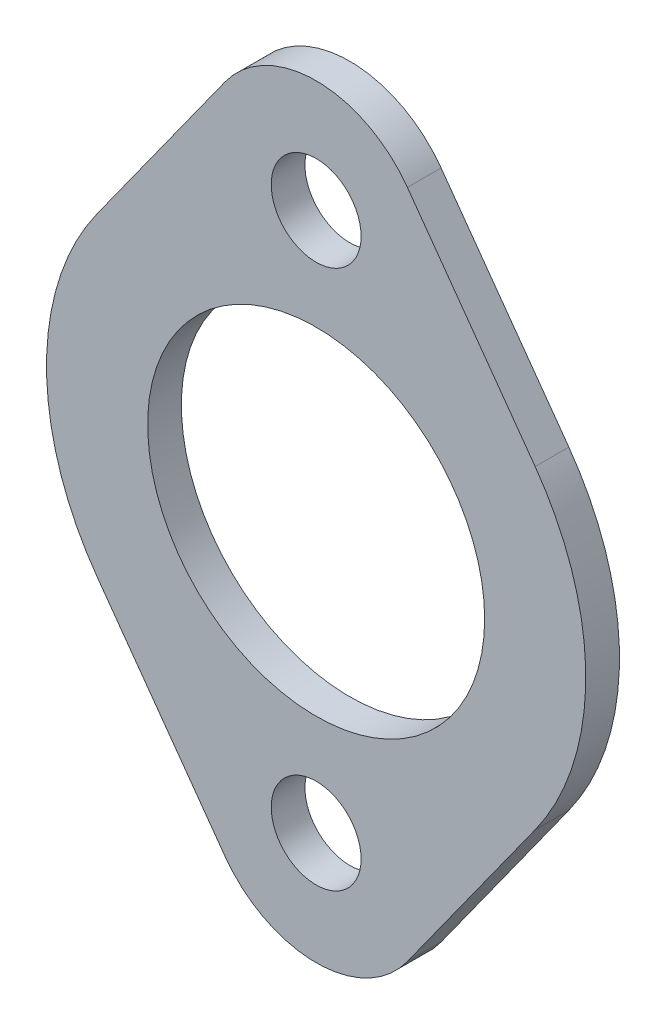
ISO-10303-21;
HEADER;
FILE_DESCRIPTION(('STEP AP214'),'2;1');
FILE_NAME('part.step','',(''),(''),'','','');
FILE_SCHEMA(('AUTOMOTIVE_DESIGN { 1 0 10303 214 1 1 1 1 }'));
ENDSEC;
DATA;
#1=APPLICATION_CONTEXT('core data for automotive mechanical design processes');
#2=APPLICATION_PROTOCOL_DEFINITION('international standard','automotive_design',2000,#1);
#3=PRODUCT_CONTEXT('',#1,'mechanical');
#4=PRODUCT('Part','Part','',(#3));
#5=PRODUCT_RELATED_PRODUCT_CATEGORY('part','',(#4));
#6=PRODUCT_DEFINITION_FORMATION('','',#4);
#7=PRODUCT_DEFINITION_CONTEXT('part definition',#1,'design');
#8=PRODUCT_DEFINITION('design','',#6,#7);
#9=PRODUCT_DEFINITION_SHAPE('','',#8);
#10=(LENGTH_UNIT() NAMED_UNIT(*) SI_UNIT(.MILLI.,.METRE.));
#11=(NAMED_UNIT(*) PLANE_ANGLE_UNIT() SI_UNIT($,.RADIAN.));
#12=(NAMED_UNIT(*) SI_UNIT($,.STERADIAN.) SOLID_ANGLE_UNIT());
#13=UNCERTAINTY_MEASURE_WITH_UNIT(LENGTH_MEASURE(1.E-05),#10,'distance_accuracy_value','');
#14=(GEOMETRIC_REPRESENTATION_CONTEXT(3) GLOBAL_UNCERTAINTY_ASSIGNED_CONTEXT((#13)) GLOBAL_UNIT_ASSIGNED_CONTEXT((#10,
#11,#12)) REPRESENTATION_CONTEXT('',''));
#15=CARTESIAN_POINT('',(0.,0.,0.));
#16=DIRECTION('',(0.,0.,1.));
#17=DIRECTION('',(1.,0.,0.));
#18=AXIS2_PLACEMENT_3D('',#15,#16,#17);
#19=CARTESIAN_POINT('',(0.,38.1,4.7625));
#20=DIRECTION('',(0.,0.,-1.));
#21=DIRECTION('',(-1.,0.,0.));
#22=AXIS2_PLACEMENT_3D('',#19,#20,#21);
#23=CYLINDRICAL_SURFACE('',#22,15.875);
#24=CARTESIAN_POINT('',(0.,38.1,0.));
#25=DIRECTION('',(0.,0.,-1.));
#26=DIRECTION('',(-1.,0.,0.));
#27=AXIS2_PLACEMENT_3D('',#24,#25,#26);
#28=CIRCLE('',#27,15.875);
#29=CARTESIAN_POINT('',(-12.8941966853202,47.3604166666667,0.));
#30=VERTEX_POINT('',#29);
#31=CARTESIAN_POINT('',(12.8941966853202,47.3604166666667,0.));
#32=VERTEX_POINT('',#31);
#33=EDGE_CURVE('E131',#30,#32,#28,.T.);
#34=ORIENTED_EDGE('',*,*,#33,.F.);
#35=DIRECTION('',(0.,0.,-1.));
#36=VECTOR('',#35,1.);
#37=CARTESIAN_POINT('',(-12.8941966853202,47.3604166666667,4.7625));
#38=LINE('',#37,#36);
#39=CARTESIAN_POINT('',(-12.8941966853202,47.3604166666667,4.7625));
#40=VERTEX_POINT('',#39);
#41=EDGE_CURVE('E11',#40,#30,#38,.T.);
#42=ORIENTED_EDGE('',*,*,#41,.F.);
#43=CARTESIAN_POINT('',(0.,38.1,4.7625));
#44=DIRECTION('',(0.,0.,-1.));
#45=DIRECTION('',(-1.,0.,0.));
#46=AXIS2_PLACEMENT_3D('',#43,#44,#45);
#47=CIRCLE('',#46,15.875);
#48=CARTESIAN_POINT('',(12.8941966853202,47.3604166666667,4.7625));
#49=VERTEX_POINT('',#48);
#50=EDGE_CURVE('E150',#40,#49,#47,.T.);
#51=ORIENTED_EDGE('',*,*,#50,.T.);
#52=DIRECTION('',(0.,0.,-1.));
#53=VECTOR('',#52,1.);
#54=CARTESIAN_POINT('',(12.8941966853202,47.3604166666667,4.7625));
#55=LINE('',#54,#53);
#56=EDGE_CURVE('E37',#49,#32,#55,.T.);
#57=ORIENTED_EDGE('',*,*,#56,.T.);
#58=EDGE_LOOP('',(#34,#42,#51,#57));
#59=FACE_BOUND('',#58,.T.);
#60=ADVANCED_FACE('F34',(#59),#23,.T.);
#61=CARTESIAN_POINT('',(-12.8941966853202,47.3604166666667,4.7625));
#62=DIRECTION('',(0.812232862067414,-0.583333333333333,0.));
#63=DIRECTION('',(0.583333333333333,0.812232862067414,0.));
#64=AXIS2_PLACEMENT_3D('',#61,#62,#63);
#65=PLANE('',#64);
#66=DIRECTION('',(-0.583333333333333,-0.812232862067414,0.));
#67=VECTOR('',#66,1.);
#68=CARTESIAN_POINT('',(-12.8941966853202,47.3604166666667,0.));
#69=LINE('',#68,#67);
#70=CARTESIAN_POINT('',(-30.9460720447685,22.225,0.));
#71=VERTEX_POINT('',#70);
#72=EDGE_CURVE('E149',#30,#71,#69,.T.);
#73=ORIENTED_EDGE('',*,*,#72,.T.);
#74=DIRECTION('',(0.,0.,-1.));
#75=VECTOR('',#74,1.);
#76=CARTESIAN_POINT('',(-30.9460720447685,22.225,4.7625));
#77=LINE('',#76,#75);
#78=CARTESIAN_POINT('',(-30.9460720447685,22.225,4.7625));
#79=VERTEX_POINT('',#78);
#80=EDGE_CURVE('E43',#79,#71,#77,.T.);
#81=ORIENTED_EDGE('',*,*,#80,.F.);
#82=DIRECTION('',(-0.583333333333333,-0.812232862067414,0.));
#83=VECTOR('',#82,1.);
#84=CARTESIAN_POINT('',(-12.8941966853202,47.3604166666667,4.7625));
#85=LINE('',#84,#83);
#86=EDGE_CURVE('E120',#40,#79,#85,.T.);
#87=ORIENTED_EDGE('',*,*,#86,.F.);
#88=ORIENTED_EDGE('',*,*,#41,.T.);
#89=EDGE_LOOP('',(#73,#81,#87,#88));
#90=FACE_BOUND('',#89,.T.);
#91=ADVANCED_FACE('F163',(#90),#65,.F.);
#92=CARTESIAN_POINT('',(0.,0.,4.7625));
#93=DIRECTION('',(0.,0.,-1.));
#94=DIRECTION('',(-1.,0.,0.));
#95=AXIS2_PLACEMENT_3D('',#92,#93,#94);
#96=CYLINDRICAL_SURFACE('',#95,38.1);
#97=CARTESIAN_POINT('',(0.,0.,0.));
#98=DIRECTION('',(0.,0.,-1.));
#99=DIRECTION('',(-1.,0.,0.));
#100=AXIS2_PLACEMENT_3D('',#97,#98,#99);
#101=CIRCLE('',#100,38.1);
#102=CARTESIAN_POINT('',(-30.9460720447684,-22.225,0.));
#103=VERTEX_POINT('',#102);
#104=EDGE_CURVE('E108',#103,#71,#101,.T.);
#105=ORIENTED_EDGE('',*,*,#104,.F.);
#106=DIRECTION('',(0.,0.,-1.));
#107=VECTOR('',#106,1.);
#108=CARTESIAN_POINT('',(-30.9460720447684,-22.225,4.7625));
#109=LINE('',#108,#107);
#110=CARTESIAN_POINT('',(-30.9460720447684,-22.225,4.7625));
#111=VERTEX_POINT('',#110);
#112=EDGE_CURVE('E103',#111,#103,#109,.T.);
#113=ORIENTED_EDGE('',*,*,#112,.F.);
#114=CARTESIAN_POINT('',(0.,0.,4.7625));
#115=DIRECTION('',(0.,0.,-1.));
#116=DIRECTION('',(-1.,0.,0.));
#117=AXIS2_PLACEMENT_3D('',#114,#115,#116);
#118=CIRCLE('',#117,38.1);
#119=EDGE_CURVE('E106',#111,#79,#118,.T.);
#120=ORIENTED_EDGE('',*,*,#119,.T.);
#121=ORIENTED_EDGE('',*,*,#80,.T.);
#122=EDGE_LOOP('',(#105,#113,#120,#121));
#123=FACE_BOUND('',#122,.T.);
#124=ADVANCED_FACE('F105',(#123),#96,.T.);
#125=CARTESIAN_POINT('',(-12.8941966853202,-47.3604166666667,4.7625));
#126=DIRECTION('',(-0.812232862067414,-0.583333333333333,0.));
#127=DIRECTION('',(0.583333333333333,-0.812232862067414,0.));
#128=AXIS2_PLACEMENT_3D('',#125,#126,#127);
#129=PLANE('',#128);
#130=DIRECTION('',(-0.583333333333333,0.812232862067414,0.));
#131=VECTOR('',#130,1.);
#132=CARTESIAN_POINT('',(-12.8941966853202,-47.3604166666667,0.));
#133=LINE('',#132,#131);
#134=CARTESIAN_POINT('',(-12.8941966853202,-47.3604166666667,0.));
#135=VERTEX_POINT('',#134);
#136=EDGE_CURVE('E146',#135,#103,#133,.T.);
#137=ORIENTED_EDGE('',*,*,#136,.F.);
#138=DIRECTION('',(0.,0.,-1.));
#139=VECTOR('',#138,1.);
#140=CARTESIAN_POINT('',(-12.8941966853202,-47.3604166666667,4.7625));
#141=LINE('',#140,#139);
#142=CARTESIAN_POINT('',(-12.8941966853202,-47.3604166666667,4.7625));
#143=VERTEX_POINT('',#142);
#144=EDGE_CURVE('E113',#143,#135,#141,.T.);
#145=ORIENTED_EDGE('',*,*,#144,.F.);
#146=DIRECTION('',(-0.583333333333333,0.812232862067414,0.));
#147=VECTOR('',#146,1.);
#148=CARTESIAN_POINT('',(-12.8941966853202,-47.3604166666667,4.7625));
#149=LINE('',#148,#147);
#150=EDGE_CURVE('E119',#143,#111,#149,.T.);
#151=ORIENTED_EDGE('',*,*,#150,.T.);
#152=ORIENTED_EDGE('',*,*,#112,.T.);
#153=EDGE_LOOP('',(#137,#145,#151,#152));
#154=FACE_BOUND('',#153,.T.);
#155=ADVANCED_FACE('F122',(#154),#129,.T.);
#156=CARTESIAN_POINT('',(0.,-38.1,4.7625));
#157=DIRECTION('',(0.,0.,-1.));
#158=DIRECTION('',(-1.,0.,0.));
#159=AXIS2_PLACEMENT_3D('',#156,#157,#158);
#160=CYLINDRICAL_SURFACE('',#159,15.875);
#161=CARTESIAN_POINT('',(0.,-38.1,0.));
#162=DIRECTION('',(0.,0.,1.));
#163=DIRECTION('',(1.,0.,0.));
#164=AXIS2_PLACEMENT_3D('',#161,#162,#163);
#165=CIRCLE('',#164,15.875);
#166=CARTESIAN_POINT('',(12.8941966853202,-47.3604166666667,0.));
#167=VERTEX_POINT('',#166);
#168=EDGE_CURVE('E144',#135,#167,#165,.T.);
#169=ORIENTED_EDGE('',*,*,#168,.T.);
#170=DIRECTION('',(0.,0.,-1.));
#171=VECTOR('',#170,1.);
#172=CARTESIAN_POINT('',(12.8941966853202,-47.3604166666667,4.7625));
#173=LINE('',#172,#171);
#174=CARTESIAN_POINT('',(12.8941966853202,-47.3604166666667,4.7625));
#175=VERTEX_POINT('',#174);
#176=EDGE_CURVE('E154',#175,#167,#173,.T.);
#177=ORIENTED_EDGE('',*,*,#176,.F.);
#178=CARTESIAN_POINT('',(0.,-38.1,4.7625));
#179=DIRECTION('',(0.,0.,1.));
#180=DIRECTION('',(1.,0.,0.));
#181=AXIS2_PLACEMENT_3D('',#178,#179,#180);
#182=CIRCLE('',#181,15.875);
#183=EDGE_CURVE('E124',#143,#175,#182,.T.);
#184=ORIENTED_EDGE('',*,*,#183,.F.);
#185=ORIENTED_EDGE('',*,*,#144,.T.);
#186=EDGE_LOOP('',(#169,#177,#184,#185));
#187=FACE_BOUND('',#186,.T.);
#188=ADVANCED_FACE('F184',(#187),#160,.T.);
#189=CARTESIAN_POINT('',(12.8941966853202,-47.3604166666667,4.7625));
#190=DIRECTION('',(-0.812232862067413,0.583333333333334,0.));
#191=DIRECTION('',(-0.583333333333334,-0.812232862067413,0.));
#192=AXIS2_PLACEMENT_3D('',#189,#190,#191);
#193=PLANE('',#192);
#194=DIRECTION('',(0.583333333333334,0.812232862067413,0.));
#195=VECTOR('',#194,1.);
#196=CARTESIAN_POINT('',(12.8941966853202,-47.3604166666667,0.));
#197=LINE('',#196,#195);
#198=CARTESIAN_POINT('',(30.9460720447685,-22.225,0.));
#199=VERTEX_POINT('',#198);
#200=EDGE_CURVE('E141',#167,#199,#197,.T.);
#201=ORIENTED_EDGE('',*,*,#200,.T.);
#202=DIRECTION('',(0.,0.,-1.));
#203=VECTOR('',#202,1.);
#204=CARTESIAN_POINT('',(30.9460720447685,-22.225,4.7625));
#205=LINE('',#204,#203);
#206=CARTESIAN_POINT('',(30.9460720447685,-22.225,4.7625));
#207=VERTEX_POINT('',#206);
#208=EDGE_CURVE('E157',#207,#199,#205,.T.);
#209=ORIENTED_EDGE('',*,*,#208,.F.);
#210=DIRECTION('',(0.583333333333334,0.812232862067413,0.));
#211=VECTOR('',#210,1.);
#212=CARTESIAN_POINT('',(12.8941966853202,-47.3604166666667,4.7625));
#213=LINE('',#212,#211);
#214=EDGE_CURVE('E126',#175,#207,#213,.T.);
#215=ORIENTED_EDGE('',*,*,#214,.F.);
#216=ORIENTED_EDGE('',*,*,#176,.T.);
#217=EDGE_LOOP('',(#201,#209,#215,#216));
#218=FACE_BOUND('',#217,.T.);
#219=ADVANCED_FACE('F178',(#218),#193,.F.);
#220=CARTESIAN_POINT('',(0.,0.,4.7625));
#221=DIRECTION('',(0.,0.,-1.));
#222=DIRECTION('',(-1.,0.,0.));
#223=AXIS2_PLACEMENT_3D('',#220,#221,#222);
#224=CYLINDRICAL_SURFACE('',#223,38.1);
#225=CARTESIAN_POINT('',(0.,0.,0.));
#226=DIRECTION('',(0.,0.,-1.));
#227=DIRECTION('',(-1.,0.,0.));
#228=AXIS2_PLACEMENT_3D('',#225,#226,#227);
#229=CIRCLE('',#228,38.1);
#230=CARTESIAN_POINT('',(30.9460720447685,22.225,0.));
#231=VERTEX_POINT('',#230);
#232=EDGE_CURVE('E138',#231,#199,#229,.T.);
#233=ORIENTED_EDGE('',*,*,#232,.F.);
#234=DIRECTION('',(0.,0.,-1.));
#235=VECTOR('',#234,1.);
#236=CARTESIAN_POINT('',(30.9460720447685,22.225,4.7625));
#237=LINE('',#236,#235);
#238=CARTESIAN_POINT('',(30.9460720447685,22.225,4.7625));
#239=VERTEX_POINT('',#238);
#240=EDGE_CURVE('E158',#239,#231,#237,.T.);
#241=ORIENTED_EDGE('',*,*,#240,.F.);
#242=CARTESIAN_POINT('',(0.,0.,4.7625));
#243=DIRECTION('',(0.,0.,-1.));
#244=DIRECTION('',(-1.,0.,0.));
#245=AXIS2_PLACEMENT_3D('',#242,#243,#244);
#246=CIRCLE('',#245,38.1);
#247=EDGE_CURVE('E167',#239,#207,#246,.T.);
#248=ORIENTED_EDGE('',*,*,#247,.T.);
#249=ORIENTED_EDGE('',*,*,#208,.T.);
#250=EDGE_LOOP('',(#233,#241,#248,#249));
#251=FACE_BOUND('',#250,.T.);
#252=ADVANCED_FACE('F181',(#251),#224,.T.);
#253=CARTESIAN_POINT('',(12.8941966853202,47.3604166666667,4.7625));
#254=DIRECTION('',(0.812232862067413,0.583333333333334,0.));
#255=DIRECTION('',(-0.583333333333334,0.812232862067413,0.));
#256=AXIS2_PLACEMENT_3D('',#253,#254,#255);
#257=PLANE('',#256);
#258=DIRECTION('',(0.583333333333334,-0.812232862067413,0.));
#259=VECTOR('',#258,1.);
#260=CARTESIAN_POINT('',(12.8941966853202,47.3604166666667,0.));
#261=LINE('',#260,#259);
#262=EDGE_CURVE('E134',#32,#231,#261,.T.);
#263=ORIENTED_EDGE('',*,*,#262,.F.);
#264=ORIENTED_EDGE('',*,*,#56,.F.);
#265=DIRECTION('',(0.583333333333334,-0.812232862067413,0.));
#266=VECTOR('',#265,1.);
#267=CARTESIAN_POINT('',(12.8941966853202,47.3604166666667,4.7625));
#268=LINE('',#267,#266);
#269=EDGE_CURVE('E165',#49,#239,#268,.T.);
#270=ORIENTED_EDGE('',*,*,#269,.T.);
#271=ORIENTED_EDGE('',*,*,#240,.T.);
#272=EDGE_LOOP('',(#263,#264,#270,#271));
#273=FACE_BOUND('',#272,.T.);
#274=ADVANCED_FACE('F160',(#273),#257,.T.);
#275=CARTESIAN_POINT('',(0.,38.1,4.7625));
#276=DIRECTION('',(0.,0.,-1.));
#277=DIRECTION('',(-1.,0.,0.));
#278=AXIS2_PLACEMENT_3D('',#275,#276,#277);
#279=PLANE('',#278);
#280=CARTESIAN_POINT('',(0.,0.,4.7625));
#281=DIRECTION('',(0.,0.,1.));
#282=DIRECTION('',(1.,0.,0.));
#283=AXIS2_PLACEMENT_3D('',#280,#281,#282);
#284=CIRCLE('',#283,23.8125);
#285=CARTESIAN_POINT('',(23.8125,0.,4.7625));
#286=VERTEX_POINT('',#285);
#287=EDGE_CURVE('E228',#286,#286,#284,.T.);
#288=ORIENTED_EDGE('',*,*,#287,.F.);
#289=EDGE_LOOP('',(#288));
#290=FACE_BOUND('',#289,.T.);
#291=CARTESIAN_POINT('',(0.,-38.1,4.7625));
#292=DIRECTION('',(0.,0.,1.));
#293=DIRECTION('',(1.,0.,0.));
#294=AXIS2_PLACEMENT_3D('',#291,#292,#293);
#295=CIRCLE('',#294,6.35);
#296=CARTESIAN_POINT('',(6.35,-38.1,4.7625));
#297=VERTEX_POINT('',#296);
#298=EDGE_CURVE('E230',#297,#297,#295,.T.);
#299=ORIENTED_EDGE('',*,*,#298,.F.);
#300=EDGE_LOOP('',(#299));
#301=FACE_BOUND('',#300,.T.);
#302=CARTESIAN_POINT('',(0.,38.1,4.7625));
#303=DIRECTION('',(0.,0.,1.));
#304=DIRECTION('',(1.,0.,0.));
#305=AXIS2_PLACEMENT_3D('',#302,#303,#304);
#306=CIRCLE('',#305,6.35);
#307=CARTESIAN_POINT('',(6.35,38.1,4.7625));
#308=VERTEX_POINT('',#307);
#309=EDGE_CURVE('E170',#308,#308,#306,.T.);
#310=ORIENTED_EDGE('',*,*,#309,.F.);
#311=EDGE_LOOP('',(#310));
#312=FACE_BOUND('',#311,.T.);
#313=ORIENTED_EDGE('',*,*,#50,.F.);
#314=ORIENTED_EDGE('',*,*,#86,.T.);
#315=ORIENTED_EDGE('',*,*,#119,.F.);
#316=ORIENTED_EDGE('',*,*,#150,.F.);
#317=ORIENTED_EDGE('',*,*,#183,.T.);
#318=ORIENTED_EDGE('',*,*,#214,.T.);
#319=ORIENTED_EDGE('',*,*,#247,.F.);
#320=ORIENTED_EDGE('',*,*,#269,.F.);
#321=EDGE_LOOP('',(#313,#314,#315,#316,#317,#318,#319,#320));
#322=FACE_BOUND('',#321,.T.);
#323=ADVANCED_FACE('F118',(#290,#301,#312,#322),#279,.F.);
#324=CARTESIAN_POINT('',(0.,38.1,0.));
#325=DIRECTION('',(0.,0.,-1.));
#326=DIRECTION('',(-1.,0.,0.));
#327=AXIS2_PLACEMENT_3D('',#324,#325,#326);
#328=PLANE('',#327);
#329=CARTESIAN_POINT('',(0.,0.,0.));
#330=DIRECTION('',(0.,0.,1.));
#331=DIRECTION('',(1.,0.,0.));
#332=AXIS2_PLACEMENT_3D('',#329,#330,#331);
#333=CIRCLE('',#332,23.8125);
#334=CARTESIAN_POINT('',(23.8125,0.,0.));
#335=VERTEX_POINT('',#334);
#336=EDGE_CURVE('E225',#335,#335,#333,.T.);
#337=ORIENTED_EDGE('',*,*,#336,.T.);
#338=EDGE_LOOP('',(#337));
#339=FACE_BOUND('',#338,.T.);
#340=CARTESIAN_POINT('',(0.,-38.1,0.));
#341=DIRECTION('',(0.,0.,1.));
#342=DIRECTION('',(1.,0.,0.));
#343=AXIS2_PLACEMENT_3D('',#340,#341,#342);
#344=CIRCLE('',#343,6.35);
#345=CARTESIAN_POINT('',(6.35,-38.1,0.));
#346=VERTEX_POINT('',#345);
#347=EDGE_CURVE('E233',#346,#346,#344,.T.);
#348=ORIENTED_EDGE('',*,*,#347,.T.);
#349=EDGE_LOOP('',(#348));
#350=FACE_BOUND('',#349,.T.);
#351=CARTESIAN_POINT('',(0.,38.1,0.));
#352=DIRECTION('',(0.,0.,1.));
#353=DIRECTION('',(1.,0.,0.));
#354=AXIS2_PLACEMENT_3D('',#351,#352,#353);
#355=CIRCLE('',#354,6.35);
#356=CARTESIAN_POINT('',(6.35,38.1,0.));
#357=VERTEX_POINT('',#356);
#358=EDGE_CURVE('E135',#357,#357,#355,.T.);
#359=ORIENTED_EDGE('',*,*,#358,.T.);
#360=EDGE_LOOP('',(#359));
#361=FACE_BOUND('',#360,.T.);
#362=ORIENTED_EDGE('',*,*,#33,.T.);
#363=ORIENTED_EDGE('',*,*,#262,.T.);
#364=ORIENTED_EDGE('',*,*,#232,.T.);
#365=ORIENTED_EDGE('',*,*,#200,.F.);
#366=ORIENTED_EDGE('',*,*,#168,.F.);
#367=ORIENTED_EDGE('',*,*,#136,.T.);
#368=ORIENTED_EDGE('',*,*,#104,.T.);
#369=ORIENTED_EDGE('',*,*,#72,.F.);
#370=EDGE_LOOP('',(#362,#363,#364,#365,#366,#367,#368,#369));
#371=FACE_BOUND('',#370,.T.);
#372=ADVANCED_FACE('F162',(#339,#350,#361,#371),#328,.T.);
#373=CARTESIAN_POINT('',(0.,38.1,0.));
#374=DIRECTION('',(0.,0.,1.));
#375=DIRECTION('',(1.,0.,0.));
#376=AXIS2_PLACEMENT_3D('',#373,#374,#375);
#377=CYLINDRICAL_SURFACE('',#376,6.35);
#378=CARTESIAN_POINT('',(6.35,38.1,0.));
#379=CARTESIAN_POINT('',(6.35,38.1,0.049609375));
#380=CARTESIAN_POINT('',(6.35,38.1,0.09921875));
#381=CARTESIAN_POINT('',(6.35,38.1,0.1984375));
#382=CARTESIAN_POINT('',(6.35,38.1,0.248046875));
#383=CARTESIAN_POINT('',(6.35,38.1,0.347265625));
#384=CARTESIAN_POINT('',(6.35,38.1,0.396875));
#385=CARTESIAN_POINT('',(6.35,38.1,0.49609375));
#386=CARTESIAN_POINT('',(6.35,38.1,0.545703125));
#387=CARTESIAN_POINT('',(6.35,38.1,0.644921875));
#388=CARTESIAN_POINT('',(6.35,38.1,0.69453125));
#389=CARTESIAN_POINT('',(6.35,38.1,0.79375));
#390=CARTESIAN_POINT('',(6.35,38.1,0.843359375));
#391=CARTESIAN_POINT('',(6.35,38.1,0.942578125));
#392=CARTESIAN_POINT('',(6.35,38.1,0.9921875));
#393=CARTESIAN_POINT('',(6.35,38.1,1.09140625));
#394=CARTESIAN_POINT('',(6.35,38.1,1.141015625));
#395=CARTESIAN_POINT('',(6.35,38.1,1.240234375));
#396=CARTESIAN_POINT('',(6.35,38.1,1.28984375));
#397=CARTESIAN_POINT('',(6.35,38.1,1.3890625));
#398=CARTESIAN_POINT('',(6.35,38.1,1.438671875));
#399=CARTESIAN_POINT('',(6.35,38.1,1.537890625));
#400=CARTESIAN_POINT('',(6.35,38.1,1.5875));
#401=CARTESIAN_POINT('',(6.35,38.1,1.68671875));
#402=CARTESIAN_POINT('',(6.35,38.1,1.736328125));
#403=CARTESIAN_POINT('',(6.35,38.1,1.835546875));
#404=CARTESIAN_POINT('',(6.35,38.1,1.88515625));
#405=CARTESIAN_POINT('',(6.35,38.1,1.984375));
#406=CARTESIAN_POINT('',(6.35,38.1,2.033984375));
#407=CARTESIAN_POINT('',(6.35,38.1,2.133203125));
#408=CARTESIAN_POINT('',(6.35,38.1,2.1828125));
#409=CARTESIAN_POINT('',(6.35,38.1,2.28203125));
#410=CARTESIAN_POINT('',(6.35,38.1,2.331640625));
#411=CARTESIAN_POINT('',(6.35,38.1,2.430859375));
#412=CARTESIAN_POINT('',(6.35,38.1,2.48046875));
#413=CARTESIAN_POINT('',(6.35,38.1,2.5796875));
#414=CARTESIAN_POINT('',(6.35,38.1,2.629296875));
#415=CARTESIAN_POINT('',(6.35,38.1,2.728515625));
#416=CARTESIAN_POINT('',(6.35,38.1,2.778125));
#417=CARTESIAN_POINT('',(6.35,38.1,2.87734375));
#418=CARTESIAN_POINT('',(6.35,38.1,2.926953125));
#419=CARTESIAN_POINT('',(6.35,38.1,3.026171875));
#420=CARTESIAN_POINT('',(6.35,38.1,3.07578125));
#421=CARTESIAN_POINT('',(6.35,38.1,3.175));
#422=CARTESIAN_POINT('',(6.35,38.1,3.224609375));
#423=CARTESIAN_POINT('',(6.35,38.1,3.323828125));
#424=CARTESIAN_POINT('',(6.35,38.1,3.3734375));
#425=CARTESIAN_POINT('',(6.35,38.1,3.47265625));
#426=CARTESIAN_POINT('',(6.35,38.1,3.522265625));
#427=CARTESIAN_POINT('',(6.35,38.1,3.621484375));
#428=CARTESIAN_POINT('',(6.35,38.1,3.67109375));
#429=CARTESIAN_POINT('',(6.35,38.1,3.7703125));
#430=CARTESIAN_POINT('',(6.35,38.1,3.819921875));
#431=CARTESIAN_POINT('',(6.35,38.1,3.919140625));
#432=CARTESIAN_POINT('',(6.35,38.1,3.96875));
#433=CARTESIAN_POINT('',(6.35,38.1,4.06796875));
#434=CARTESIAN_POINT('',(6.35,38.1,4.117578125));
#435=CARTESIAN_POINT('',(6.35,38.1,4.216796875));
#436=CARTESIAN_POINT('',(6.35,38.1,4.26640625));
#437=CARTESIAN_POINT('',(6.35,38.1,4.365625));
#438=CARTESIAN_POINT('',(6.35,38.1,4.415234375));
#439=CARTESIAN_POINT('',(6.35,38.1,4.514453125));
#440=CARTESIAN_POINT('',(6.35,38.1,4.5640625));
#441=CARTESIAN_POINT('',(6.35,38.1,4.66328125));
#442=CARTESIAN_POINT('',(6.35,38.1,4.712890625));
#443=CARTESIAN_POINT('',(6.35,38.1,4.7625));
#444=B_SPLINE_CURVE_WITH_KNOTS('',3,(#378,#379,#380,#381,#382,#383,#384,#385,#386,#387,#388,
#389,#390,#391,#392,#393,#394,#395,#396,#397,#398,#399,#400,#401,#402,#403,#404,#405,#406,#407,
#408,#409,#410,#411,#412,#413,#414,#415,#416,#417,#418,#419,#420,#421,#422,#423,#424,#425,#426,
#427,#428,#429,#430,#431,#432,#433,#434,#435,#436,#437,#438,#439,#440,#441,#442,#443),
.UNSPECIFIED.,.F.,.F.,(4,2,2,2,2,2,2,2,2,2,2,2,2,2,2,2,2,2,2,2,2,2,2,2,2,2,2,2,2,2,2,2,4),(0.,
0.148828125,0.29765625,0.446484375,0.5953125,0.744140625,0.89296875,1.041796875,1.190625,
1.339453125,1.48828125,1.637109375,1.7859375,1.934765625,2.08359375,2.232421875,2.38125,
2.530078125,2.67890625,2.827734375,2.9765625,3.125390625,3.27421875,3.423046875,3.571875,
3.720703125,3.86953125,4.018359375,4.1671875,4.316015625,4.46484375,4.613671875,4.7625),.UNSPECIFIED.);
#445=EDGE_CURVE('BSEAM205',#357,#308,#444,.T.);
#446=ORIENTED_EDGE('',*,*,#358,.F.);
#447=ORIENTED_EDGE('',*,*,#309,.T.);
#448=ORIENTED_EDGE('',*,*,#445,.T.);
#449=ORIENTED_EDGE('',*,*,#445,.F.);
#450=EDGE_LOOP('',(#446,#448,#447,#449));
#451=FACE_BOUND('',#450,.T.);
#452=ADVANCED_FACE('F205',(#451),#377,.F.);
#453=CARTESIAN_POINT('',(0.,-38.1,0.));
#454=DIRECTION('',(0.,0.,1.));
#455=DIRECTION('',(1.,0.,0.));
#456=AXIS2_PLACEMENT_3D('',#453,#454,#455);
#457=CYLINDRICAL_SURFACE('',#456,6.35);
#458=CARTESIAN_POINT('',(6.35,-38.1,0.));
#459=CARTESIAN_POINT('',(6.35,-38.1,0.049609375));
#460=CARTESIAN_POINT('',(6.35,-38.1,0.09921875));
#461=CARTESIAN_POINT('',(6.35,-38.1,0.1984375));
#462=CARTESIAN_POINT('',(6.35,-38.1,0.248046875));
#463=CARTESIAN_POINT('',(6.35,-38.1,0.347265625));
#464=CARTESIAN_POINT('',(6.35,-38.1,0.396875));
#465=CARTESIAN_POINT('',(6.35,-38.1,0.49609375));
#466=CARTESIAN_POINT('',(6.35,-38.1,0.545703125));
#467=CARTESIAN_POINT('',(6.35,-38.1,0.644921875));
#468=CARTESIAN_POINT('',(6.35,-38.1,0.69453125));
#469=CARTESIAN_POINT('',(6.35,-38.1,0.79375));
#470=CARTESIAN_POINT('',(6.35,-38.1,0.843359375));
#471=CARTESIAN_POINT('',(6.35,-38.1,0.942578125));
#472=CARTESIAN_POINT('',(6.35,-38.1,0.9921875));
#473=CARTESIAN_POINT('',(6.35,-38.1,1.09140625));
#474=CARTESIAN_POINT('',(6.35,-38.1,1.141015625));
#475=CARTESIAN_POINT('',(6.35,-38.1,1.240234375));
#476=CARTESIAN_POINT('',(6.35,-38.1,1.28984375));
#477=CARTESIAN_POINT('',(6.35,-38.1,1.3890625));
#478=CARTESIAN_POINT('',(6.35,-38.1,1.438671875));
#479=CARTESIAN_POINT('',(6.35,-38.1,1.537890625));
#480=CARTESIAN_POINT('',(6.35,-38.1,1.5875));
#481=CARTESIAN_POINT('',(6.35,-38.1,1.68671875));
#482=CARTESIAN_POINT('',(6.35,-38.1,1.736328125));
#483=CARTESIAN_POINT('',(6.35,-38.1,1.835546875));
#484=CARTESIAN_POINT('',(6.35,-38.1,1.88515625));
#485=CARTESIAN_POINT('',(6.35,-38.1,1.984375));
#486=CARTESIAN_POINT('',(6.35,-38.1,2.033984375));
#487=CARTESIAN_POINT('',(6.35,-38.1,2.133203125));
#488=CARTESIAN_POINT('',(6.35,-38.1,2.1828125));
#489=CARTESIAN_POINT('',(6.35,-38.1,2.28203125));
#490=CARTESIAN_POINT('',(6.35,-38.1,2.331640625));
#491=CARTESIAN_POINT('',(6.35,-38.1,2.430859375));
#492=CARTESIAN_POINT('',(6.35,-38.1,2.48046875));
#493=CARTESIAN_POINT('',(6.35,-38.1,2.5796875));
#494=CARTESIAN_POINT('',(6.35,-38.1,2.629296875));
#495=CARTESIAN_POINT('',(6.35,-38.1,2.728515625));
#496=CARTESIAN_POINT('',(6.35,-38.1,2.778125));
#497=CARTESIAN_POINT('',(6.35,-38.1,2.87734375));
#498=CARTESIAN_POINT('',(6.35,-38.1,2.926953125));
#499=CARTESIAN_POINT('',(6.35,-38.1,3.026171875));
#500=CARTESIAN_POINT('',(6.35,-38.1,3.07578125));
#501=CARTESIAN_POINT('',(6.35,-38.1,3.175));
#502=CARTESIAN_POINT('',(6.35,-38.1,3.224609375));
#503=CARTESIAN_POINT('',(6.35,-38.1,3.323828125));
#504=CARTESIAN_POINT('',(6.35,-38.1,3.3734375));
#505=CARTESIAN_POINT('',(6.35,-38.1,3.47265625));
#506=CARTESIAN_POINT('',(6.35,-38.1,3.522265625));
#507=CARTESIAN_POINT('',(6.35,-38.1,3.621484375));
#508=CARTESIAN_POINT('',(6.35,-38.1,3.67109375));
#509=CARTESIAN_POINT('',(6.35,-38.1,3.7703125));
#510=CARTESIAN_POINT('',(6.35,-38.1,3.819921875));
#511=CARTESIAN_POINT('',(6.35,-38.1,3.919140625));
#512=CARTESIAN_POINT('',(6.35,-38.1,3.96875));
#513=CARTESIAN_POINT('',(6.35,-38.1,4.06796875));
#514=CARTESIAN_POINT('',(6.35,-38.1,4.117578125));
#515=CARTESIAN_POINT('',(6.35,-38.1,4.216796875));
#516=CARTESIAN_POINT('',(6.35,-38.1,4.26640625));
#517=CARTESIAN_POINT('',(6.35,-38.1,4.365625));
#518=CARTESIAN_POINT('',(6.35,-38.1,4.415234375));
#519=CARTESIAN_POINT('',(6.35,-38.1,4.514453125));
#520=CARTESIAN_POINT('',(6.35,-38.1,4.5640625));
#521=CARTESIAN_POINT('',(6.35,-38.1,4.66328125));
#522=CARTESIAN_POINT('',(6.35,-38.1,4.712890625));
#523=CARTESIAN_POINT('',(6.35,-38.1,4.7625));
#524=B_SPLINE_CURVE_WITH_KNOTS('',3,(#458,#459,#460,#461,#462,#463,#464,#465,#466,#467,#468,
#469,#470,#471,#472,#473,#474,#475,#476,#477,#478,#479,#480,#481,#482,#483,#484,#485,#486,#487,
#488,#489,#490,#491,#492,#493,#494,#495,#496,#497,#498,#499,#500,#501,#502,#503,#504,#505,#506,
#507,#508,#509,#510,#511,#512,#513,#514,#515,#516,#517,#518,#519,#520,#521,#522,#523),
.UNSPECIFIED.,.F.,.F.,(4,2,2,2,2,2,2,2,2,2,2,2,2,2,2,2,2,2,2,2,2,2,2,2,2,2,2,2,2,2,2,2,4),(0.,
0.148828125,0.29765625,0.446484375,0.5953125,0.744140625,0.89296875,1.041796875,1.190625,
1.339453125,1.48828125,1.637109375,1.7859375,1.934765625,2.08359375,2.232421875,2.38125,
2.530078125,2.67890625,2.827734375,2.9765625,3.125390625,3.27421875,3.423046875,3.571875,
3.720703125,3.86953125,4.018359375,4.1671875,4.316015625,4.46484375,4.613671875,4.7625),.UNSPECIFIED.);
#525=EDGE_CURVE('BSEAM212',#346,#297,#524,.T.);
#526=ORIENTED_EDGE('',*,*,#347,.F.);
#527=ORIENTED_EDGE('',*,*,#298,.T.);
#528=ORIENTED_EDGE('',*,*,#525,.T.);
#529=ORIENTED_EDGE('',*,*,#525,.F.);
#530=EDGE_LOOP('',(#526,#528,#527,#529));
#531=FACE_BOUND('',#530,.T.);
#532=ADVANCED_FACE('F212',(#531),#457,.F.);
#533=CARTESIAN_POINT('',(0.,0.,0.));
#534=DIRECTION('',(0.,0.,1.));
#535=DIRECTION('',(1.,0.,0.));
#536=AXIS2_PLACEMENT_3D('',#533,#534,#535);
#537=CYLINDRICAL_SURFACE('',#536,23.8125);
#538=CARTESIAN_POINT('',(23.8125,0.,0.));
#539=CARTESIAN_POINT('',(23.8125,0.,0.049609375));
#540=CARTESIAN_POINT('',(23.8125,0.,0.09921875));
#541=CARTESIAN_POINT('',(23.8125,0.,0.1984375));
#542=CARTESIAN_POINT('',(23.8125,0.,0.248046875));
#543=CARTESIAN_POINT('',(23.8125,0.,0.347265625));
#544=CARTESIAN_POINT('',(23.8125,0.,0.396875));
#545=CARTESIAN_POINT('',(23.8125,0.,0.49609375));
#546=CARTESIAN_POINT('',(23.8125,0.,0.545703125));
#547=CARTESIAN_POINT('',(23.8125,0.,0.644921875));
#548=CARTESIAN_POINT('',(23.8125,0.,0.69453125));
#549=CARTESIAN_POINT('',(23.8125,0.,0.79375));
#550=CARTESIAN_POINT('',(23.8125,0.,0.843359375));
#551=CARTESIAN_POINT('',(23.8125,0.,0.942578125));
#552=CARTESIAN_POINT('',(23.8125,0.,0.9921875));
#553=CARTESIAN_POINT('',(23.8125,0.,1.09140625));
#554=CARTESIAN_POINT('',(23.8125,0.,1.141015625));
#555=CARTESIAN_POINT('',(23.8125,0.,1.240234375));
#556=CARTESIAN_POINT('',(23.8125,0.,1.28984375));
#557=CARTESIAN_POINT('',(23.8125,0.,1.3890625));
#558=CARTESIAN_POINT('',(23.8125,0.,1.438671875));
#559=CARTESIAN_POINT('',(23.8125,0.,1.537890625));
#560=CARTESIAN_POINT('',(23.8125,0.,1.5875));
#561=CARTESIAN_POINT('',(23.8125,0.,1.68671875));
#562=CARTESIAN_POINT('',(23.8125,0.,1.736328125));
#563=CARTESIAN_POINT('',(23.8125,0.,1.835546875));
#564=CARTESIAN_POINT('',(23.8125,0.,1.88515625));
#565=CARTESIAN_POINT('',(23.8125,0.,1.984375));
#566=CARTESIAN_POINT('',(23.8125,0.,2.033984375));
#567=CARTESIAN_POINT('',(23.8125,0.,2.133203125));
#568=CARTESIAN_POINT('',(23.8125,0.,2.1828125));
#569=CARTESIAN_POINT('',(23.8125,0.,2.28203125));
#570=CARTESIAN_POINT('',(23.8125,0.,2.331640625));
#571=CARTESIAN_POINT('',(23.8125,0.,2.430859375));
#572=CARTESIAN_POINT('',(23.8125,0.,2.48046875));
#573=CARTESIAN_POINT('',(23.8125,0.,2.5796875));
#574=CARTESIAN_POINT('',(23.8125,0.,2.629296875));
#575=CARTESIAN_POINT('',(23.8125,0.,2.728515625));
#576=CARTESIAN_POINT('',(23.8125,0.,2.778125));
#577=CARTESIAN_POINT('',(23.8125,0.,2.87734375));
#578=CARTESIAN_POINT('',(23.8125,0.,2.926953125));
#579=CARTESIAN_POINT('',(23.8125,0.,3.026171875));
#580=CARTESIAN_POINT('',(23.8125,0.,3.07578125));
#581=CARTESIAN_POINT('',(23.8125,0.,3.175));
#582=CARTESIAN_POINT('',(23.8125,0.,3.224609375));
#583=CARTESIAN_POINT('',(23.8125,0.,3.323828125));
#584=CARTESIAN_POINT('',(23.8125,0.,3.3734375));
#585=CARTESIAN_POINT('',(23.8125,0.,3.47265625));
#586=CARTESIAN_POINT('',(23.8125,0.,3.522265625));
#587=CARTESIAN_POINT('',(23.8125,0.,3.621484375));
#588=CARTESIAN_POINT('',(23.8125,0.,3.67109375));
#589=CARTESIAN_POINT('',(23.8125,0.,3.7703125));
#590=CARTESIAN_POINT('',(23.8125,0.,3.819921875));
#591=CARTESIAN_POINT('',(23.8125,0.,3.919140625));
#592=CARTESIAN_POINT('',(23.8125,0.,3.96875));
#593=CARTESIAN_POINT('',(23.8125,0.,4.06796875));
#594=CARTESIAN_POINT('',(23.8125,0.,4.117578125));
#595=CARTESIAN_POINT('',(23.8125,0.,4.216796875));
#596=CARTESIAN_POINT('',(23.8125,0.,4.26640625));
#597=CARTESIAN_POINT('',(23.8125,0.,4.365625));
#598=CARTESIAN_POINT('',(23.8125,0.,4.415234375));
#599=CARTESIAN_POINT('',(23.8125,0.,4.514453125));
#600=CARTESIAN_POINT('',(23.8125,0.,4.5640625));
#601=CARTESIAN_POINT('',(23.8125,0.,4.66328125));
#602=CARTESIAN_POINT('',(23.8125,0.,4.712890625));
#603=CARTESIAN_POINT('',(23.8125,0.,4.7625));
#604=B_SPLINE_CURVE_WITH_KNOTS('',3,(#538,#539,#540,#541,#542,#543,#544,#545,#546,#547,#548,
#549,#550,#551,#552,#553,#554,#555,#556,#557,#558,#559,#560,#561,#562,#563,#564,#565,#566,#567,
#568,#569,#570,#571,#572,#573,#574,#575,#576,#577,#578,#579,#580,#581,#582,#583,#584,#585,#586,
#587,#588,#589,#590,#591,#592,#593,#594,#595,#596,#597,#598,#599,#600,#601,#602,#603),
.UNSPECIFIED.,.F.,.F.,(4,2,2,2,2,2,2,2,2,2,2,2,2,2,2,2,2,2,2,2,2,2,2,2,2,2,2,2,2,2,2,2,4),(0.,
0.148828125,0.29765625,0.446484375,0.5953125,0.744140625,0.89296875,1.041796875,1.190625,
1.339453125,1.48828125,1.637109375,1.7859375,1.934765625,2.08359375,2.232421875,2.38125,
2.530078125,2.67890625,2.827734375,2.9765625,3.125390625,3.27421875,3.423046875,3.571875,
3.720703125,3.86953125,4.018359375,4.1671875,4.316015625,4.46484375,4.613671875,4.7625),.UNSPECIFIED.);
#605=EDGE_CURVE('BSEAM216',#335,#286,#604,.T.);
#606=ORIENTED_EDGE('',*,*,#336,.F.);
#607=ORIENTED_EDGE('',*,*,#287,.T.);
#608=ORIENTED_EDGE('',*,*,#605,.T.);
#609=ORIENTED_EDGE('',*,*,#605,.F.);
#610=EDGE_LOOP('',(#606,#608,#607,#609));
#611=FACE_BOUND('',#610,.T.);
#612=ADVANCED_FACE('F216',(#611),#537,.F.);
#613=CLOSED_SHELL('',(#60,#91,#124,#155,#188,#219,#252,#274,#323,#372,#452,#532,#612));
#614=MANIFOLD_SOLID_BREP('B2',#613);
#615=ADVANCED_BREP_SHAPE_REPRESENTATION('',(#18,#614),#14);
#616=SHAPE_DEFINITION_REPRESENTATION(#9,#615);
ENDSEC;
END-ISO-10303-21;
